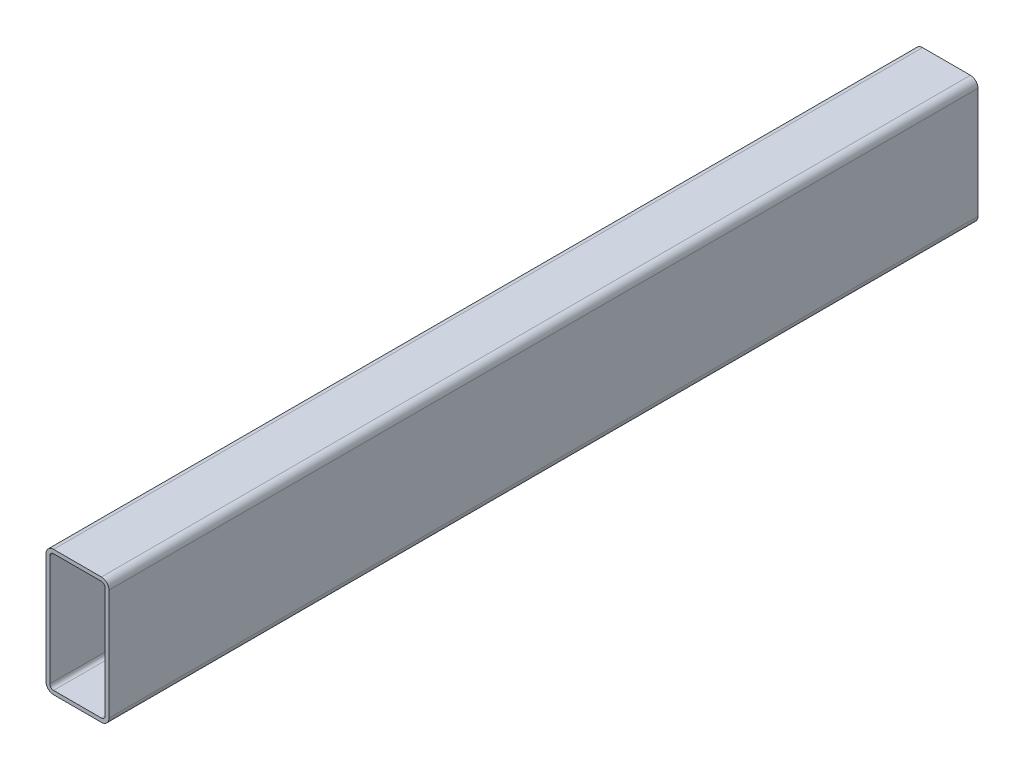
ISO-10303-21;
HEADER;
FILE_DESCRIPTION(('STEP AP214'),'2;1');
FILE_NAME('part.step','',(''),(''),'','','');
FILE_SCHEMA(('AUTOMOTIVE_DESIGN { 1 0 10303 214 1 1 1 1 }'));
ENDSEC;
DATA;
#1=APPLICATION_CONTEXT('core data for automotive mechanical design processes');
#2=APPLICATION_PROTOCOL_DEFINITION('international standard','automotive_design',2000,#1);
#3=PRODUCT_CONTEXT('',#1,'mechanical');
#4=PRODUCT('Part','Part','',(#3));
#5=PRODUCT_RELATED_PRODUCT_CATEGORY('part','',(#4));
#6=PRODUCT_DEFINITION_FORMATION('','',#4);
#7=PRODUCT_DEFINITION_CONTEXT('part definition',#1,'design');
#8=PRODUCT_DEFINITION('design','',#6,#7);
#9=PRODUCT_DEFINITION_SHAPE('','',#8);
#10=(LENGTH_UNIT() NAMED_UNIT(*) SI_UNIT(.MILLI.,.METRE.));
#11=(NAMED_UNIT(*) PLANE_ANGLE_UNIT() SI_UNIT($,.RADIAN.));
#12=(NAMED_UNIT(*) SI_UNIT($,.STERADIAN.) SOLID_ANGLE_UNIT());
#13=UNCERTAINTY_MEASURE_WITH_UNIT(LENGTH_MEASURE(1.E-05),#10,'distance_accuracy_value','');
#14=(GEOMETRIC_REPRESENTATION_CONTEXT(3) GLOBAL_UNCERTAINTY_ASSIGNED_CONTEXT((#13)) GLOBAL_UNIT_ASSIGNED_CONTEXT((#10,
#11,#12)) REPRESENTATION_CONTEXT('',''));
#15=CARTESIAN_POINT('',(0.,0.,0.));
#16=DIRECTION('',(0.,0.,1.));
#17=DIRECTION('',(1.,0.,0.));
#18=AXIS2_PLACEMENT_3D('',#15,#16,#17);
#19=CARTESIAN_POINT('',(19.,44.,345.));
#20=DIRECTION('',(0.,0.,-1.));
#21=DIRECTION('',(-1.,0.,0.));
#22=AXIS2_PLACEMENT_3D('',#19,#20,#21);
#23=PLANE('',#22);
#24=CARTESIAN_POINT('',(19.,44.,345.));
#25=DIRECTION('',(0.,0.,1.));
#26=DIRECTION('',(-1.,0.,0.));
#27=AXIS2_PLACEMENT_3D('',#24,#25,#26);
#28=CIRCLE('',#27,6.);
#29=CARTESIAN_POINT('',(25.,44.,345.));
#30=VERTEX_POINT('',#29);
#31=CARTESIAN_POINT('',(19.,50.,345.));
#32=VERTEX_POINT('',#31);
#33=EDGE_CURVE('E211',#30,#32,#28,.T.);
#34=ORIENTED_EDGE('',*,*,#33,.T.);
#35=DIRECTION('',(-1.,0.,0.));
#36=VECTOR('',#35,1.);
#37=CARTESIAN_POINT('',(-19.,50.,345.));
#38=LINE('',#37,#36);
#39=CARTESIAN_POINT('',(-19.,50.,345.));
#40=VERTEX_POINT('',#39);
#41=EDGE_CURVE('E214',#32,#40,#38,.T.);
#42=ORIENTED_EDGE('',*,*,#41,.T.);
#43=CARTESIAN_POINT('',(-19.,44.,345.));
#44=DIRECTION('',(0.,0.,1.));
#45=DIRECTION('',(1.,0.,0.));
#46=AXIS2_PLACEMENT_3D('',#43,#44,#45);
#47=CIRCLE('',#46,6.);
#48=CARTESIAN_POINT('',(-25.,44.,345.));
#49=VERTEX_POINT('',#48);
#50=EDGE_CURVE('E217',#40,#49,#47,.T.);
#51=ORIENTED_EDGE('',*,*,#50,.T.);
#52=DIRECTION('',(0.,-1.,0.));
#53=VECTOR('',#52,1.);
#54=CARTESIAN_POINT('',(-25.,44.,345.));
#55=LINE('',#54,#53);
#56=CARTESIAN_POINT('',(-25.,-44.,345.));
#57=VERTEX_POINT('',#56);
#58=EDGE_CURVE('E219',#49,#57,#55,.T.);
#59=ORIENTED_EDGE('',*,*,#58,.T.);
#60=CARTESIAN_POINT('',(-19.,-44.,345.));
#61=DIRECTION('',(0.,0.,1.));
#62=DIRECTION('',(-1.,0.,0.));
#63=AXIS2_PLACEMENT_3D('',#60,#61,#62);
#64=CIRCLE('',#63,6.);
#65=CARTESIAN_POINT('',(-19.,-50.,345.));
#66=VERTEX_POINT('',#65);
#67=EDGE_CURVE('E221',#57,#66,#64,.T.);
#68=ORIENTED_EDGE('',*,*,#67,.T.);
#69=DIRECTION('',(1.,0.,0.));
#70=VECTOR('',#69,1.);
#71=CARTESIAN_POINT('',(-19.,-50.,345.));
#72=LINE('',#71,#70);
#73=CARTESIAN_POINT('',(19.,-50.,345.));
#74=VERTEX_POINT('',#73);
#75=EDGE_CURVE('E223',#66,#74,#72,.T.);
#76=ORIENTED_EDGE('',*,*,#75,.T.);
#77=CARTESIAN_POINT('',(19.,-44.,345.));
#78=DIRECTION('',(0.,0.,1.));
#79=DIRECTION('',(1.,0.,0.));
#80=AXIS2_PLACEMENT_3D('',#77,#78,#79);
#81=CIRCLE('',#80,6.);
#82=CARTESIAN_POINT('',(25.,-44.,345.));
#83=VERTEX_POINT('',#82);
#84=EDGE_CURVE('E225',#74,#83,#81,.T.);
#85=ORIENTED_EDGE('',*,*,#84,.T.);
#86=DIRECTION('',(0.,1.,0.));
#87=VECTOR('',#86,1.);
#88=CARTESIAN_POINT('',(25.,44.,345.));
#89=LINE('',#88,#87);
#90=EDGE_CURVE('E227',#83,#30,#89,.T.);
#91=ORIENTED_EDGE('',*,*,#90,.T.);
#92=EDGE_LOOP('',(#34,#42,#51,#59,#68,#76,#85,#91));
#93=FACE_BOUND('',#92,.T.);
#94=CARTESIAN_POINT('',(-19.,44.,345.));
#95=DIRECTION('',(0.,0.,1.));
#96=DIRECTION('',(1.,0.,0.));
#97=AXIS2_PLACEMENT_3D('',#94,#95,#96);
#98=CIRCLE('',#97,3.);
#99=CARTESIAN_POINT('',(-19.,47.,345.));
#100=VERTEX_POINT('',#99);
#101=CARTESIAN_POINT('',(-22.,44.,345.));
#102=VERTEX_POINT('',#101);
#103=EDGE_CURVE('E146',#100,#102,#98,.T.);
#104=ORIENTED_EDGE('',*,*,#103,.F.);
#105=DIRECTION('',(-1.,0.,0.));
#106=VECTOR('',#105,1.);
#107=CARTESIAN_POINT('',(-19.,47.,345.));
#108=LINE('',#107,#106);
#109=CARTESIAN_POINT('',(19.,47.,345.));
#110=VERTEX_POINT('',#109);
#111=EDGE_CURVE('E179',#110,#100,#108,.T.);
#112=ORIENTED_EDGE('',*,*,#111,.F.);
#113=CARTESIAN_POINT('',(19.,44.,345.));
#114=DIRECTION('',(0.,0.,1.));
#115=DIRECTION('',(-1.,0.,0.));
#116=AXIS2_PLACEMENT_3D('',#113,#114,#115);
#117=CIRCLE('',#116,3.);
#118=CARTESIAN_POINT('',(22.,44.,345.));
#119=VERTEX_POINT('',#118);
#120=EDGE_CURVE('E177',#119,#110,#117,.T.);
#121=ORIENTED_EDGE('',*,*,#120,.F.);
#122=DIRECTION('',(0.,1.,0.));
#123=VECTOR('',#122,1.);
#124=CARTESIAN_POINT('',(22.,44.,345.));
#125=LINE('',#124,#123);
#126=CARTESIAN_POINT('',(22.,-44.,345.));
#127=VERTEX_POINT('',#126);
#128=EDGE_CURVE('E175',#127,#119,#125,.T.);
#129=ORIENTED_EDGE('',*,*,#128,.F.);
#130=CARTESIAN_POINT('',(19.,-44.,345.));
#131=DIRECTION('',(0.,0.,1.));
#132=DIRECTION('',(1.,0.,0.));
#133=AXIS2_PLACEMENT_3D('',#130,#131,#132);
#134=CIRCLE('',#133,3.);
#135=CARTESIAN_POINT('',(19.,-47.,345.));
#136=VERTEX_POINT('',#135);
#137=EDGE_CURVE('E173',#136,#127,#134,.T.);
#138=ORIENTED_EDGE('',*,*,#137,.F.);
#139=DIRECTION('',(1.,0.,0.));
#140=VECTOR('',#139,1.);
#141=CARTESIAN_POINT('',(-19.,-47.,345.));
#142=LINE('',#141,#140);
#143=CARTESIAN_POINT('',(-19.,-47.,345.));
#144=VERTEX_POINT('',#143);
#145=EDGE_CURVE('E169',#144,#136,#142,.T.);
#146=ORIENTED_EDGE('',*,*,#145,.F.);
#147=CARTESIAN_POINT('',(-19.,-44.,345.));
#148=DIRECTION('',(0.,0.,1.));
#149=DIRECTION('',(-1.,0.,0.));
#150=AXIS2_PLACEMENT_3D('',#147,#148,#149);
#151=CIRCLE('',#150,3.00000000000001);
#152=CARTESIAN_POINT('',(-22.,-44.,345.));
#153=VERTEX_POINT('',#152);
#154=EDGE_CURVE('E167',#153,#144,#151,.T.);
#155=ORIENTED_EDGE('',*,*,#154,.F.);
#156=DIRECTION('',(0.,-1.,0.));
#157=VECTOR('',#156,1.);
#158=CARTESIAN_POINT('',(-22.,44.,345.));
#159=LINE('',#158,#157);
#160=EDGE_CURVE('E154',#102,#153,#159,.T.);
#161=ORIENTED_EDGE('',*,*,#160,.F.);
#162=EDGE_LOOP('',(#104,#112,#121,#129,#138,#146,#155,#161));
#163=FACE_BOUND('',#162,.T.);
#164=ADVANCED_FACE('F33',(#93,#163),#23,.F.);
#165=CARTESIAN_POINT('',(19.,44.,-345.));
#166=DIRECTION('',(0.,0.,-1.));
#167=DIRECTION('',(-1.,0.,0.));
#168=AXIS2_PLACEMENT_3D('',#165,#166,#167);
#169=PLANE('',#168);
#170=CARTESIAN_POINT('',(19.,44.,-345.));
#171=DIRECTION('',(0.,0.,1.));
#172=DIRECTION('',(-1.,0.,0.));
#173=AXIS2_PLACEMENT_3D('',#170,#171,#172);
#174=CIRCLE('',#173,6.);
#175=CARTESIAN_POINT('',(25.,44.,-345.));
#176=VERTEX_POINT('',#175);
#177=CARTESIAN_POINT('',(19.,50.,-345.));
#178=VERTEX_POINT('',#177);
#179=EDGE_CURVE('E162',#176,#178,#174,.T.);
#180=ORIENTED_EDGE('',*,*,#179,.F.);
#181=DIRECTION('',(0.,1.,0.));
#182=VECTOR('',#181,1.);
#183=CARTESIAN_POINT('',(25.,44.,-345.));
#184=LINE('',#183,#182);
#185=CARTESIAN_POINT('',(25.,-44.,-345.));
#186=VERTEX_POINT('',#185);
#187=EDGE_CURVE('E215',#186,#176,#184,.T.);
#188=ORIENTED_EDGE('',*,*,#187,.F.);
#189=CARTESIAN_POINT('',(19.,-44.,-345.));
#190=DIRECTION('',(0.,0.,1.));
#191=DIRECTION('',(1.,0.,0.));
#192=AXIS2_PLACEMENT_3D('',#189,#190,#191);
#193=CIRCLE('',#192,6.);
#194=CARTESIAN_POINT('',(19.,-50.,-345.));
#195=VERTEX_POINT('',#194);
#196=EDGE_CURVE('E242',#195,#186,#193,.T.);
#197=ORIENTED_EDGE('',*,*,#196,.F.);
#198=DIRECTION('',(1.,0.,0.));
#199=VECTOR('',#198,1.);
#200=CARTESIAN_POINT('',(-19.,-50.,-345.));
#201=LINE('',#200,#199);
#202=CARTESIAN_POINT('',(-19.,-50.,-345.));
#203=VERTEX_POINT('',#202);
#204=EDGE_CURVE('E240',#203,#195,#201,.T.);
#205=ORIENTED_EDGE('',*,*,#204,.F.);
#206=CARTESIAN_POINT('',(-19.,-44.,-345.));
#207=DIRECTION('',(0.,0.,1.));
#208=DIRECTION('',(-1.,0.,0.));
#209=AXIS2_PLACEMENT_3D('',#206,#207,#208);
#210=CIRCLE('',#209,6.);
#211=CARTESIAN_POINT('',(-25.,-44.,-345.));
#212=VERTEX_POINT('',#211);
#213=EDGE_CURVE('E238',#212,#203,#210,.T.);
#214=ORIENTED_EDGE('',*,*,#213,.F.);
#215=DIRECTION('',(0.,-1.,0.));
#216=VECTOR('',#215,1.);
#217=CARTESIAN_POINT('',(-25.,44.,-345.));
#218=LINE('',#217,#216);
#219=CARTESIAN_POINT('',(-25.,44.,-345.));
#220=VERTEX_POINT('',#219);
#221=EDGE_CURVE('E236',#220,#212,#218,.T.);
#222=ORIENTED_EDGE('',*,*,#221,.F.);
#223=CARTESIAN_POINT('',(-19.,44.,-345.));
#224=DIRECTION('',(0.,0.,1.));
#225=DIRECTION('',(1.,0.,0.));
#226=AXIS2_PLACEMENT_3D('',#223,#224,#225);
#227=CIRCLE('',#226,6.);
#228=CARTESIAN_POINT('',(-19.,50.,-345.));
#229=VERTEX_POINT('',#228);
#230=EDGE_CURVE('E234',#229,#220,#227,.T.);
#231=ORIENTED_EDGE('',*,*,#230,.F.);
#232=DIRECTION('',(-1.,0.,0.));
#233=VECTOR('',#232,1.);
#234=CARTESIAN_POINT('',(-19.,50.,-345.));
#235=LINE('',#234,#233);
#236=EDGE_CURVE('E232',#178,#229,#235,.T.);
#237=ORIENTED_EDGE('',*,*,#236,.F.);
#238=EDGE_LOOP('',(#180,#188,#197,#205,#214,#222,#231,#237));
#239=FACE_BOUND('',#238,.T.);
#240=DIRECTION('',(-1.,0.,0.));
#241=VECTOR('',#240,1.);
#242=CARTESIAN_POINT('',(-19.,47.,-345.));
#243=LINE('',#242,#241);
#244=CARTESIAN_POINT('',(19.,47.,-345.));
#245=VERTEX_POINT('',#244);
#246=CARTESIAN_POINT('',(-19.,47.,-345.));
#247=VERTEX_POINT('',#246);
#248=EDGE_CURVE('E155',#245,#247,#243,.T.);
#249=ORIENTED_EDGE('',*,*,#248,.T.);
#250=CARTESIAN_POINT('',(-19.,44.,-345.));
#251=DIRECTION('',(0.,0.,1.));
#252=DIRECTION('',(1.,0.,0.));
#253=AXIS2_PLACEMENT_3D('',#250,#251,#252);
#254=CIRCLE('',#253,3.);
#255=CARTESIAN_POINT('',(-22.,44.,-345.));
#256=VERTEX_POINT('',#255);
#257=EDGE_CURVE('E56',#247,#256,#254,.T.);
#258=ORIENTED_EDGE('',*,*,#257,.T.);
#259=DIRECTION('',(0.,-1.,0.));
#260=VECTOR('',#259,1.);
#261=CARTESIAN_POINT('',(-22.,44.,-345.));
#262=LINE('',#261,#260);
#263=CARTESIAN_POINT('',(-22.,-44.,-345.));
#264=VERTEX_POINT('',#263);
#265=EDGE_CURVE('E161',#256,#264,#262,.T.);
#266=ORIENTED_EDGE('',*,*,#265,.T.);
#267=CARTESIAN_POINT('',(-19.,-44.,-345.));
#268=DIRECTION('',(0.,0.,1.));
#269=DIRECTION('',(-1.,0.,0.));
#270=AXIS2_PLACEMENT_3D('',#267,#268,#269);
#271=CIRCLE('',#270,3.00000000000001);
#272=CARTESIAN_POINT('',(-19.,-47.,-345.));
#273=VERTEX_POINT('',#272);
#274=EDGE_CURVE('E183',#264,#273,#271,.T.);
#275=ORIENTED_EDGE('',*,*,#274,.T.);
#276=DIRECTION('',(1.,0.,0.));
#277=VECTOR('',#276,1.);
#278=CARTESIAN_POINT('',(-19.,-47.,-345.));
#279=LINE('',#278,#277);
#280=CARTESIAN_POINT('',(19.,-47.,-345.));
#281=VERTEX_POINT('',#280);
#282=EDGE_CURVE('E186',#273,#281,#279,.T.);
#283=ORIENTED_EDGE('',*,*,#282,.T.);
#284=CARTESIAN_POINT('',(19.,-44.,-345.));
#285=DIRECTION('',(0.,0.,1.));
#286=DIRECTION('',(1.,0.,0.));
#287=AXIS2_PLACEMENT_3D('',#284,#285,#286);
#288=CIRCLE('',#287,3.);
#289=CARTESIAN_POINT('',(22.,-44.,-345.));
#290=VERTEX_POINT('',#289);
#291=EDGE_CURVE('E189',#281,#290,#288,.T.);
#292=ORIENTED_EDGE('',*,*,#291,.T.);
#293=DIRECTION('',(0.,1.,0.));
#294=VECTOR('',#293,1.);
#295=CARTESIAN_POINT('',(22.,44.,-345.));
#296=LINE('',#295,#294);
#297=CARTESIAN_POINT('',(22.,44.,-345.));
#298=VERTEX_POINT('',#297);
#299=EDGE_CURVE('E192',#290,#298,#296,.T.);
#300=ORIENTED_EDGE('',*,*,#299,.T.);
#301=CARTESIAN_POINT('',(19.,44.,-345.));
#302=DIRECTION('',(0.,0.,1.));
#303=DIRECTION('',(-1.,0.,0.));
#304=AXIS2_PLACEMENT_3D('',#301,#302,#303);
#305=CIRCLE('',#304,3.);
#306=EDGE_CURVE('E195',#298,#245,#305,.T.);
#307=ORIENTED_EDGE('',*,*,#306,.T.);
#308=EDGE_LOOP('',(#249,#258,#266,#275,#283,#292,#300,#307));
#309=FACE_BOUND('',#308,.T.);
#310=ADVANCED_FACE('F272',(#239,#309),#169,.T.);
#311=CARTESIAN_POINT('',(19.,44.,345.));
#312=DIRECTION('',(0.,0.,-1.));
#313=DIRECTION('',(-1.,0.,0.));
#314=AXIS2_PLACEMENT_3D('',#311,#312,#313);
#315=CYLINDRICAL_SURFACE('',#314,6.);
#316=ORIENTED_EDGE('',*,*,#179,.T.);
#317=DIRECTION('',(0.,0.,-1.));
#318=VECTOR('',#317,1.);
#319=CARTESIAN_POINT('',(19.,50.,345.));
#320=LINE('',#319,#318);
#321=EDGE_CURVE('E11',#32,#178,#320,.T.);
#322=ORIENTED_EDGE('',*,*,#321,.F.);
#323=ORIENTED_EDGE('',*,*,#33,.F.);
#324=DIRECTION('',(0.,0.,-1.));
#325=VECTOR('',#324,1.);
#326=CARTESIAN_POINT('',(25.,44.,345.));
#327=LINE('',#326,#325);
#328=EDGE_CURVE('E229',#30,#176,#327,.T.);
#329=ORIENTED_EDGE('',*,*,#328,.T.);
#330=EDGE_LOOP('',(#316,#322,#323,#329));
#331=FACE_BOUND('',#330,.T.);
#332=ADVANCED_FACE('F35',(#331),#315,.T.);
#333=CARTESIAN_POINT('',(-19.,50.,345.));
#334=DIRECTION('',(0.,-1.,0.));
#335=DIRECTION('',(0.,0.,-1.));
#336=AXIS2_PLACEMENT_3D('',#333,#334,#335);
#337=PLANE('',#336);
#338=ORIENTED_EDGE('',*,*,#236,.T.);
#339=DIRECTION('',(0.,0.,-1.));
#340=VECTOR('',#339,1.);
#341=CARTESIAN_POINT('',(-19.,50.,345.));
#342=LINE('',#341,#340);
#343=EDGE_CURVE('E41',#40,#229,#342,.T.);
#344=ORIENTED_EDGE('',*,*,#343,.F.);
#345=ORIENTED_EDGE('',*,*,#41,.F.);
#346=ORIENTED_EDGE('',*,*,#321,.T.);
#347=EDGE_LOOP('',(#338,#344,#345,#346));
#348=FACE_BOUND('',#347,.T.);
#349=ADVANCED_FACE('F289',(#348),#337,.F.);
#350=CARTESIAN_POINT('',(-19.,44.,345.));
#351=DIRECTION('',(0.,0.,-1.));
#352=DIRECTION('',(-1.,0.,0.));
#353=AXIS2_PLACEMENT_3D('',#350,#351,#352);
#354=CYLINDRICAL_SURFACE('',#353,6.);
#355=ORIENTED_EDGE('',*,*,#230,.T.);
#356=DIRECTION('',(0.,0.,-1.));
#357=VECTOR('',#356,1.);
#358=CARTESIAN_POINT('',(-25.,44.,345.));
#359=LINE('',#358,#357);
#360=EDGE_CURVE('E259',#49,#220,#359,.T.);
#361=ORIENTED_EDGE('',*,*,#360,.F.);
#362=ORIENTED_EDGE('',*,*,#50,.F.);
#363=ORIENTED_EDGE('',*,*,#343,.T.);
#364=EDGE_LOOP('',(#355,#361,#362,#363));
#365=FACE_BOUND('',#364,.T.);
#366=ADVANCED_FACE('F266',(#365),#354,.T.);
#367=CARTESIAN_POINT('',(-25.,44.,345.));
#368=DIRECTION('',(1.,0.,0.));
#369=DIRECTION('',(0.,0.,-1.));
#370=AXIS2_PLACEMENT_3D('',#367,#368,#369);
#371=PLANE('',#370);
#372=ORIENTED_EDGE('',*,*,#221,.T.);
#373=DIRECTION('',(0.,0.,-1.));
#374=VECTOR('',#373,1.);
#375=CARTESIAN_POINT('',(-25.,-44.,345.));
#376=LINE('',#375,#374);
#377=EDGE_CURVE('E256',#57,#212,#376,.T.);
#378=ORIENTED_EDGE('',*,*,#377,.F.);
#379=ORIENTED_EDGE('',*,*,#58,.F.);
#380=ORIENTED_EDGE('',*,*,#360,.T.);
#381=EDGE_LOOP('',(#372,#378,#379,#380));
#382=FACE_BOUND('',#381,.T.);
#383=ADVANCED_FACE('F278',(#382),#371,.F.);
#384=CARTESIAN_POINT('',(-19.,-44.,345.));
#385=DIRECTION('',(0.,0.,-1.));
#386=DIRECTION('',(-1.,0.,0.));
#387=AXIS2_PLACEMENT_3D('',#384,#385,#386);
#388=CYLINDRICAL_SURFACE('',#387,6.);
#389=ORIENTED_EDGE('',*,*,#213,.T.);
#390=DIRECTION('',(0.,0.,-1.));
#391=VECTOR('',#390,1.);
#392=CARTESIAN_POINT('',(-19.,-50.,345.));
#393=LINE('',#392,#391);
#394=EDGE_CURVE('E253',#66,#203,#393,.T.);
#395=ORIENTED_EDGE('',*,*,#394,.F.);
#396=ORIENTED_EDGE('',*,*,#67,.F.);
#397=ORIENTED_EDGE('',*,*,#377,.T.);
#398=EDGE_LOOP('',(#389,#395,#396,#397));
#399=FACE_BOUND('',#398,.T.);
#400=ADVANCED_FACE('F282',(#399),#388,.T.);
#401=CARTESIAN_POINT('',(-19.,-50.,345.));
#402=DIRECTION('',(0.,1.,0.));
#403=DIRECTION('',(0.,0.,1.));
#404=AXIS2_PLACEMENT_3D('',#401,#402,#403);
#405=PLANE('',#404);
#406=ORIENTED_EDGE('',*,*,#204,.T.);
#407=DIRECTION('',(0.,0.,-1.));
#408=VECTOR('',#407,1.);
#409=CARTESIAN_POINT('',(19.,-50.,345.));
#410=LINE('',#409,#408);
#411=EDGE_CURVE('E250',#74,#195,#410,.T.);
#412=ORIENTED_EDGE('',*,*,#411,.F.);
#413=ORIENTED_EDGE('',*,*,#75,.F.);
#414=ORIENTED_EDGE('',*,*,#394,.T.);
#415=EDGE_LOOP('',(#406,#412,#413,#414));
#416=FACE_BOUND('',#415,.T.);
#417=ADVANCED_FACE('F302',(#416),#405,.F.);
#418=CARTESIAN_POINT('',(19.,-44.,345.));
#419=DIRECTION('',(0.,0.,-1.));
#420=DIRECTION('',(-1.,0.,0.));
#421=AXIS2_PLACEMENT_3D('',#418,#419,#420);
#422=CYLINDRICAL_SURFACE('',#421,6.);
#423=ORIENTED_EDGE('',*,*,#196,.T.);
#424=DIRECTION('',(0.,0.,-1.));
#425=VECTOR('',#424,1.);
#426=CARTESIAN_POINT('',(25.,-44.,345.));
#427=LINE('',#426,#425);
#428=EDGE_CURVE('E247',#83,#186,#427,.T.);
#429=ORIENTED_EDGE('',*,*,#428,.F.);
#430=ORIENTED_EDGE('',*,*,#84,.F.);
#431=ORIENTED_EDGE('',*,*,#411,.T.);
#432=EDGE_LOOP('',(#423,#429,#430,#431));
#433=FACE_BOUND('',#432,.T.);
#434=ADVANCED_FACE('F300',(#433),#422,.T.);
#435=CARTESIAN_POINT('',(25.,44.,345.));
#436=DIRECTION('',(-1.,0.,0.));
#437=DIRECTION('',(0.,0.,1.));
#438=AXIS2_PLACEMENT_3D('',#435,#436,#437);
#439=PLANE('',#438);
#440=ORIENTED_EDGE('',*,*,#187,.T.);
#441=ORIENTED_EDGE('',*,*,#328,.F.);
#442=ORIENTED_EDGE('',*,*,#90,.F.);
#443=ORIENTED_EDGE('',*,*,#428,.T.);
#444=EDGE_LOOP('',(#440,#441,#442,#443));
#445=FACE_BOUND('',#444,.T.);
#446=ADVANCED_FACE('F295',(#445),#439,.F.);
#447=CARTESIAN_POINT('',(-19.,44.,345.));
#448=DIRECTION('',(0.,0.,-1.));
#449=DIRECTION('',(-1.,0.,0.));
#450=AXIS2_PLACEMENT_3D('',#447,#448,#449);
#451=CYLINDRICAL_SURFACE('',#450,3.);
#452=ORIENTED_EDGE('',*,*,#257,.F.);
#453=DIRECTION('',(0.,0.,-1.));
#454=VECTOR('',#453,1.);
#455=CARTESIAN_POINT('',(-19.,47.,345.));
#456=LINE('',#455,#454);
#457=EDGE_CURVE('E150',#100,#247,#456,.T.);
#458=ORIENTED_EDGE('',*,*,#457,.F.);
#459=ORIENTED_EDGE('',*,*,#103,.T.);
#460=DIRECTION('',(0.,0.,-1.));
#461=VECTOR('',#460,1.);
#462=CARTESIAN_POINT('',(-22.,44.,345.));
#463=LINE('',#462,#461);
#464=EDGE_CURVE('E149',#102,#256,#463,.T.);
#465=ORIENTED_EDGE('',*,*,#464,.T.);
#466=EDGE_LOOP('',(#452,#458,#459,#465));
#467=FACE_BOUND('',#466,.T.);
#468=ADVANCED_FACE('F148',(#467),#451,.F.);
#469=CARTESIAN_POINT('',(-22.,44.,345.));
#470=DIRECTION('',(1.,0.,0.));
#471=DIRECTION('',(0.,1.,0.));
#472=AXIS2_PLACEMENT_3D('',#469,#470,#471);
#473=PLANE('',#472);
#474=ORIENTED_EDGE('',*,*,#265,.F.);
#475=ORIENTED_EDGE('',*,*,#464,.F.);
#476=ORIENTED_EDGE('',*,*,#160,.T.);
#477=DIRECTION('',(0.,0.,-1.));
#478=VECTOR('',#477,1.);
#479=CARTESIAN_POINT('',(-22.,-44.,345.));
#480=LINE('',#479,#478);
#481=EDGE_CURVE('E163',#153,#264,#480,.T.);
#482=ORIENTED_EDGE('',*,*,#481,.T.);
#483=EDGE_LOOP('',(#474,#475,#476,#482));
#484=FACE_BOUND('',#483,.T.);
#485=ADVANCED_FACE('F158',(#484),#473,.T.);
#486=CARTESIAN_POINT('',(-19.,-44.,345.));
#487=DIRECTION('',(0.,0.,-1.));
#488=DIRECTION('',(-1.,0.,0.));
#489=AXIS2_PLACEMENT_3D('',#486,#487,#488);
#490=CYLINDRICAL_SURFACE('',#489,3.00000000000001);
#491=ORIENTED_EDGE('',*,*,#274,.F.);
#492=ORIENTED_EDGE('',*,*,#481,.F.);
#493=ORIENTED_EDGE('',*,*,#154,.T.);
#494=DIRECTION('',(0.,0.,-1.));
#495=VECTOR('',#494,1.);
#496=CARTESIAN_POINT('',(-19.,-47.,345.));
#497=LINE('',#496,#495);
#498=EDGE_CURVE('E208',#144,#273,#497,.T.);
#499=ORIENTED_EDGE('',*,*,#498,.T.);
#500=EDGE_LOOP('',(#491,#492,#493,#499));
#501=FACE_BOUND('',#500,.T.);
#502=ADVANCED_FACE('F327',(#501),#490,.F.);
#503=CARTESIAN_POINT('',(-19.,-47.,345.));
#504=DIRECTION('',(0.,1.,0.));
#505=DIRECTION('',(-1.,0.,0.));
#506=AXIS2_PLACEMENT_3D('',#503,#504,#505);
#507=PLANE('',#506);
#508=ORIENTED_EDGE('',*,*,#282,.F.);
#509=ORIENTED_EDGE('',*,*,#498,.F.);
#510=ORIENTED_EDGE('',*,*,#145,.T.);
#511=DIRECTION('',(0.,0.,-1.));
#512=VECTOR('',#511,1.);
#513=CARTESIAN_POINT('',(19.,-47.,345.));
#514=LINE('',#513,#512);
#515=EDGE_CURVE('E206',#136,#281,#514,.T.);
#516=ORIENTED_EDGE('',*,*,#515,.T.);
#517=EDGE_LOOP('',(#508,#509,#510,#516));
#518=FACE_BOUND('',#517,.T.);
#519=ADVANCED_FACE('F331',(#518),#507,.T.);
#520=CARTESIAN_POINT('',(19.,-44.,345.));
#521=DIRECTION('',(0.,0.,-1.));
#522=DIRECTION('',(-1.,0.,0.));
#523=AXIS2_PLACEMENT_3D('',#520,#521,#522);
#524=CYLINDRICAL_SURFACE('',#523,3.);
#525=ORIENTED_EDGE('',*,*,#291,.F.);
#526=ORIENTED_EDGE('',*,*,#515,.F.);
#527=ORIENTED_EDGE('',*,*,#137,.T.);
#528=DIRECTION('',(0.,0.,-1.));
#529=VECTOR('',#528,1.);
#530=CARTESIAN_POINT('',(22.,-44.,345.));
#531=LINE('',#530,#529);
#532=EDGE_CURVE('E204',#127,#290,#531,.T.);
#533=ORIENTED_EDGE('',*,*,#532,.T.);
#534=EDGE_LOOP('',(#525,#526,#527,#533));
#535=FACE_BOUND('',#534,.T.);
#536=ADVANCED_FACE('F337',(#535),#524,.F.);
#537=CARTESIAN_POINT('',(22.,44.,345.));
#538=DIRECTION('',(-1.,0.,0.));
#539=DIRECTION('',(0.,-1.,0.));
#540=AXIS2_PLACEMENT_3D('',#537,#538,#539);
#541=PLANE('',#540);
#542=ORIENTED_EDGE('',*,*,#299,.F.);
#543=ORIENTED_EDGE('',*,*,#532,.F.);
#544=ORIENTED_EDGE('',*,*,#128,.T.);
#545=DIRECTION('',(0.,0.,-1.));
#546=VECTOR('',#545,1.);
#547=CARTESIAN_POINT('',(22.,44.,345.));
#548=LINE('',#547,#546);
#549=EDGE_CURVE('E202',#119,#298,#548,.T.);
#550=ORIENTED_EDGE('',*,*,#549,.T.);
#551=EDGE_LOOP('',(#542,#543,#544,#550));
#552=FACE_BOUND('',#551,.T.);
#553=ADVANCED_FACE('F341',(#552),#541,.T.);
#554=CARTESIAN_POINT('',(19.,44.,345.));
#555=DIRECTION('',(0.,0.,-1.));
#556=DIRECTION('',(-1.,0.,0.));
#557=AXIS2_PLACEMENT_3D('',#554,#555,#556);
#558=CYLINDRICAL_SURFACE('',#557,3.);
#559=ORIENTED_EDGE('',*,*,#306,.F.);
#560=ORIENTED_EDGE('',*,*,#549,.F.);
#561=ORIENTED_EDGE('',*,*,#120,.T.);
#562=DIRECTION('',(0.,0.,-1.));
#563=VECTOR('',#562,1.);
#564=CARTESIAN_POINT('',(19.,47.,345.));
#565=LINE('',#564,#563);
#566=EDGE_CURVE('E48',#110,#245,#565,.T.);
#567=ORIENTED_EDGE('',*,*,#566,.T.);
#568=EDGE_LOOP('',(#559,#560,#561,#567));
#569=FACE_BOUND('',#568,.T.);
#570=ADVANCED_FACE('F345',(#569),#558,.F.);
#571=CARTESIAN_POINT('',(-19.,47.,345.));
#572=DIRECTION('',(0.,-1.,0.));
#573=DIRECTION('',(1.,0.,0.));
#574=AXIS2_PLACEMENT_3D('',#571,#572,#573);
#575=PLANE('',#574);
#576=ORIENTED_EDGE('',*,*,#248,.F.);
#577=ORIENTED_EDGE('',*,*,#566,.F.);
#578=ORIENTED_EDGE('',*,*,#111,.T.);
#579=ORIENTED_EDGE('',*,*,#457,.T.);
#580=EDGE_LOOP('',(#576,#577,#578,#579));
#581=FACE_BOUND('',#580,.T.);
#582=ADVANCED_FACE('F349',(#581),#575,.T.);
#583=CLOSED_SHELL('',(#164,#310,#332,#349,#366,#383,#400,#417,#434,#446,#468,#485,#502,#519,
#536,#553,#570,#582));
#584=MANIFOLD_SOLID_BREP('B2',#583);
#585=ADVANCED_BREP_SHAPE_REPRESENTATION('',(#18,#584),#14);
#586=SHAPE_DEFINITION_REPRESENTATION(#9,#585);
ENDSEC;
END-ISO-10303-21;
